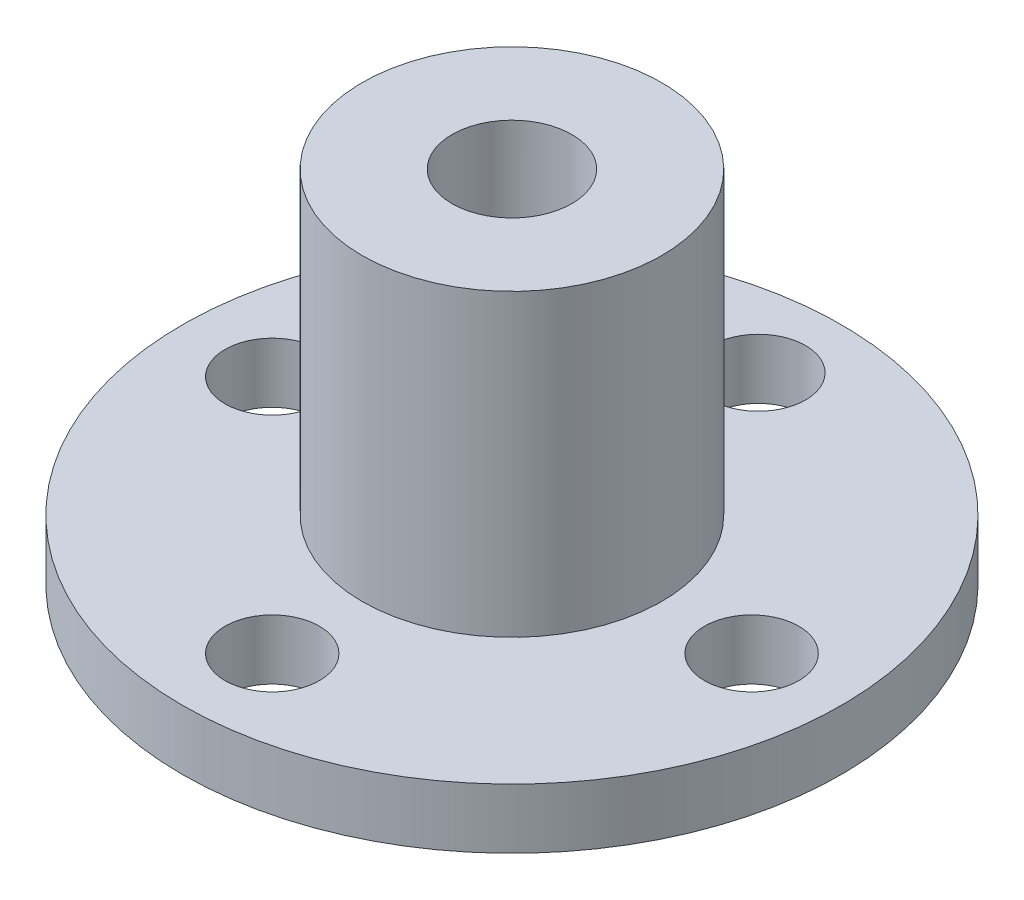
ISO-10303-21;
HEADER;
FILE_DESCRIPTION(('STEP AP214'),'2;1');
FILE_NAME('part.step','',(''),(''),'','','');
FILE_SCHEMA(('AUTOMOTIVE_DESIGN { 1 0 10303 214 1 1 1 1 }'));
ENDSEC;
DATA;
#1=APPLICATION_CONTEXT('core data for automotive mechanical design processes');
#2=APPLICATION_PROTOCOL_DEFINITION('international standard','automotive_design',2000,#1);
#3=PRODUCT_CONTEXT('',#1,'mechanical');
#4=PRODUCT('Part','Part','',(#3));
#5=PRODUCT_RELATED_PRODUCT_CATEGORY('part','',(#4));
#6=PRODUCT_DEFINITION_FORMATION('','',#4);
#7=PRODUCT_DEFINITION_CONTEXT('part definition',#1,'design');
#8=PRODUCT_DEFINITION('design','',#6,#7);
#9=PRODUCT_DEFINITION_SHAPE('','',#8);
#10=(LENGTH_UNIT() NAMED_UNIT(*) SI_UNIT(.MILLI.,.METRE.));
#11=(NAMED_UNIT(*) PLANE_ANGLE_UNIT() SI_UNIT($,.RADIAN.));
#12=(NAMED_UNIT(*) SI_UNIT($,.STERADIAN.) SOLID_ANGLE_UNIT());
#13=UNCERTAINTY_MEASURE_WITH_UNIT(LENGTH_MEASURE(1.E-05),#10,'distance_accuracy_value','');
#14=(GEOMETRIC_REPRESENTATION_CONTEXT(3) GLOBAL_UNCERTAINTY_ASSIGNED_CONTEXT((#13)) GLOBAL_UNIT_ASSIGNED_CONTEXT((#10,
#11,#12)) REPRESENTATION_CONTEXT('',''));
#15=CARTESIAN_POINT('',(0.,0.,0.));
#16=DIRECTION('',(0.,0.,1.));
#17=DIRECTION('',(1.,0.,0.));
#18=AXIS2_PLACEMENT_3D('',#15,#16,#17);
#19=CARTESIAN_POINT('',(0.,2.,0.));
#20=DIRECTION('',(0.,-1.,0.));
#21=DIRECTION('',(0.,0.,-1.));
#22=AXIS2_PLACEMENT_3D('',#19,#20,#21);
#23=CYLINDRICAL_SURFACE('',#22,11.);
#24=CARTESIAN_POINT('',(0.,2.,0.));
#25=DIRECTION('',(0.,1.,0.));
#26=DIRECTION('',(0.,0.,1.));
#27=AXIS2_PLACEMENT_3D('',#24,#25,#26);
#28=CIRCLE('',#27,11.);
#29=CARTESIAN_POINT('',(0.,2.,11.));
#30=VERTEX_POINT('',#29);
#31=EDGE_CURVE('E47',#30,#30,#28,.T.);
#32=ORIENTED_EDGE('',*,*,#31,.F.);
#33=EDGE_LOOP('',(#32));
#34=FACE_BOUND('',#33,.T.);
#35=CARTESIAN_POINT('',(0.,0.,0.));
#36=DIRECTION('',(0.,1.,0.));
#37=DIRECTION('',(0.,0.,1.));
#38=AXIS2_PLACEMENT_3D('',#35,#36,#37);
#39=CIRCLE('',#38,11.);
#40=CARTESIAN_POINT('',(0.,0.,11.));
#41=VERTEX_POINT('',#40);
#42=EDGE_CURVE('E52',#41,#41,#39,.T.);
#43=ORIENTED_EDGE('',*,*,#42,.T.);
#44=EDGE_LOOP('',(#43));
#45=FACE_BOUND('',#44,.T.);
#46=ADVANCED_FACE('F35',(#34,#45),#23,.T.);
#47=CARTESIAN_POINT('',(0.,2.,0.));
#48=DIRECTION('',(0.,1.,0.));
#49=DIRECTION('',(0.,0.,1.));
#50=AXIS2_PLACEMENT_3D('',#47,#48,#49);
#51=PLANE('',#50);
#52=CARTESIAN_POINT('',(-8.,2.,0.));
#53=DIRECTION('',(0.,1.,0.));
#54=DIRECTION('',(0.,0.,1.));
#55=AXIS2_PLACEMENT_3D('',#52,#53,#54);
#56=CIRCLE('',#55,1.57499999999999);
#57=CARTESIAN_POINT('',(-8.,2.,1.57499999999999));
#58=VERTEX_POINT('',#57);
#59=EDGE_CURVE('E118',#58,#58,#56,.T.);
#60=ORIENTED_EDGE('',*,*,#59,.F.);
#61=EDGE_LOOP('',(#60));
#62=FACE_BOUND('',#61,.T.);
#63=CARTESIAN_POINT('',(0.,2.,-8.22505420593829));
#64=DIRECTION('',(0.,1.,0.));
#65=DIRECTION('',(0.,0.,1.));
#66=AXIS2_PLACEMENT_3D('',#63,#64,#65);
#67=CIRCLE('',#66,1.57499999999999);
#68=CARTESIAN_POINT('',(0.,2.,-6.6500542059383));
#69=VERTEX_POINT('',#68);
#70=EDGE_CURVE('E122',#69,#69,#67,.T.);
#71=ORIENTED_EDGE('',*,*,#70,.F.);
#72=EDGE_LOOP('',(#71));
#73=FACE_BOUND('',#72,.T.);
#74=CARTESIAN_POINT('',(8.,2.,0.));
#75=DIRECTION('',(0.,1.,0.));
#76=DIRECTION('',(0.,0.,1.));
#77=AXIS2_PLACEMENT_3D('',#74,#75,#76);
#78=CIRCLE('',#77,1.57499999999999);
#79=CARTESIAN_POINT('',(8.,2.,1.57499999999999));
#80=VERTEX_POINT('',#79);
#81=EDGE_CURVE('E74',#80,#80,#78,.T.);
#82=ORIENTED_EDGE('',*,*,#81,.F.);
#83=EDGE_LOOP('',(#82));
#84=FACE_BOUND('',#83,.T.);
#85=CARTESIAN_POINT('',(0.,2.,8.));
#86=DIRECTION('',(0.,1.,0.));
#87=DIRECTION('',(0.,0.,1.));
#88=AXIS2_PLACEMENT_3D('',#85,#86,#87);
#89=CIRCLE('',#88,1.57499999999999);
#90=CARTESIAN_POINT('',(0.,2.,9.57499999999999));
#91=VERTEX_POINT('',#90);
#92=EDGE_CURVE('E62',#91,#91,#89,.T.);
#93=ORIENTED_EDGE('',*,*,#92,.F.);
#94=EDGE_LOOP('',(#93));
#95=FACE_BOUND('',#94,.T.);
#96=CARTESIAN_POINT('',(0.,2.,0.));
#97=DIRECTION('',(0.,1.,0.));
#98=DIRECTION('',(0.,0.,1.));
#99=AXIS2_PLACEMENT_3D('',#96,#97,#98);
#100=CIRCLE('',#99,5.);
#101=CARTESIAN_POINT('',(0.,2.,5.));
#102=VERTEX_POINT('',#101);
#103=EDGE_CURVE('E10',#102,#102,#100,.T.);
#104=ORIENTED_EDGE('',*,*,#103,.F.);
#105=EDGE_LOOP('',(#104));
#106=FACE_BOUND('',#105,.T.);
#107=ORIENTED_EDGE('',*,*,#31,.T.);
#108=EDGE_LOOP('',(#107));
#109=FACE_BOUND('',#108,.T.);
#110=ADVANCED_FACE('F97',(#62,#73,#84,#95,#106,#109),#51,.T.);
#111=CARTESIAN_POINT('',(0.,0.,0.));
#112=DIRECTION('',(0.,1.,0.));
#113=DIRECTION('',(0.,0.,1.));
#114=AXIS2_PLACEMENT_3D('',#111,#112,#113);
#115=PLANE('',#114);
#116=CARTESIAN_POINT('',(-8.,0.,0.));
#117=DIRECTION('',(0.,1.,0.));
#118=DIRECTION('',(0.,0.,1.));
#119=AXIS2_PLACEMENT_3D('',#116,#117,#118);
#120=CIRCLE('',#119,1.57499999999999);
#121=CARTESIAN_POINT('',(-8.,0.,1.57499999999999));
#122=VERTEX_POINT('',#121);
#123=EDGE_CURVE('E133',#122,#122,#120,.T.);
#124=ORIENTED_EDGE('',*,*,#123,.T.);
#125=EDGE_LOOP('',(#124));
#126=FACE_BOUND('',#125,.T.);
#127=CARTESIAN_POINT('',(0.,0.,-8.22505420593829));
#128=DIRECTION('',(0.,1.,0.));
#129=DIRECTION('',(0.,0.,1.));
#130=AXIS2_PLACEMENT_3D('',#127,#128,#129);
#131=CIRCLE('',#130,1.57499999999999);
#132=CARTESIAN_POINT('',(0.,0.,-6.6500542059383));
#133=VERTEX_POINT('',#132);
#134=EDGE_CURVE('E128',#133,#133,#131,.T.);
#135=ORIENTED_EDGE('',*,*,#134,.T.);
#136=EDGE_LOOP('',(#135));
#137=FACE_BOUND('',#136,.T.);
#138=CARTESIAN_POINT('',(8.,0.,0.));
#139=DIRECTION('',(0.,1.,0.));
#140=DIRECTION('',(0.,0.,1.));
#141=AXIS2_PLACEMENT_3D('',#138,#139,#140);
#142=CIRCLE('',#141,1.57499999999999);
#143=CARTESIAN_POINT('',(8.,0.,1.57499999999999));
#144=VERTEX_POINT('',#143);
#145=EDGE_CURVE('E69',#144,#144,#142,.T.);
#146=ORIENTED_EDGE('',*,*,#145,.T.);
#147=EDGE_LOOP('',(#146));
#148=FACE_BOUND('',#147,.T.);
#149=CARTESIAN_POINT('',(0.,0.,8.));
#150=DIRECTION('',(0.,1.,0.));
#151=DIRECTION('',(0.,0.,1.));
#152=AXIS2_PLACEMENT_3D('',#149,#150,#151);
#153=CIRCLE('',#152,1.57499999999999);
#154=CARTESIAN_POINT('',(0.,0.,9.57499999999999));
#155=VERTEX_POINT('',#154);
#156=EDGE_CURVE('E59',#155,#155,#153,.T.);
#157=ORIENTED_EDGE('',*,*,#156,.T.);
#158=EDGE_LOOP('',(#157));
#159=FACE_BOUND('',#158,.T.);
#160=CARTESIAN_POINT('',(0.,0.,0.));
#161=DIRECTION('',(0.,1.,0.));
#162=DIRECTION('',(0.,0.,1.));
#163=AXIS2_PLACEMENT_3D('',#160,#161,#162);
#164=CIRCLE('',#163,2.);
#165=CARTESIAN_POINT('',(0.,0.,2.));
#166=VERTEX_POINT('',#165);
#167=EDGE_CURVE('E66',#166,#166,#164,.F.);
#168=ORIENTED_EDGE('',*,*,#167,.F.);
#169=EDGE_LOOP('',(#168));
#170=FACE_BOUND('',#169,.T.);
#171=ORIENTED_EDGE('',*,*,#42,.F.);
#172=EDGE_LOOP('',(#171));
#173=FACE_BOUND('',#172,.T.);
#174=ADVANCED_FACE('F87',(#126,#137,#148,#159,#170,#173),#115,.F.);
#175=CARTESIAN_POINT('',(0.,12.,0.));
#176=DIRECTION('',(0.,-1.,0.));
#177=DIRECTION('',(0.,0.,-1.));
#178=AXIS2_PLACEMENT_3D('',#175,#176,#177);
#179=CYLINDRICAL_SURFACE('',#178,5.);
#180=CARTESIAN_POINT('',(0.,8.5,-5.));
#181=CARTESIAN_POINT('',(-0.0822886127532999,8.49999900251511,-4.9999992925055));
#182=CARTESIAN_POINT('',(-0.164587318351529,8.49320613637603,-4.99794915693954));
#183=CARTESIAN_POINT('',(-0.326788125304881,8.4662786457779,-4.98997105593691));
#184=CARTESIAN_POINT('',(-0.40668950441142,8.44614004197666,-4.98404193389692));
#185=CARTESIAN_POINT('',(-0.561732707754527,8.39325398308974,-4.96895552501836));
#186=CARTESIAN_POINT('',(-0.636881364395373,8.36052513038107,-4.95980300250425));
#187=CARTESIAN_POINT('',(-0.780624181053132,8.28346390694417,-4.93922109237645));
#188=CARTESIAN_POINT('',(-0.84921746746967,8.23912999260458,-4.92779140192067));
#189=CARTESIAN_POINT('',(-0.979871797183745,8.13877599252733,-4.90350737192774));
#190=CARTESIAN_POINT('',(-1.04171807124434,8.08248337411409,-4.89062383657036));
#191=CARTESIAN_POINT('',(-1.15524920923324,7.96039077008982,-4.86505834210442));
#192=CARTESIAN_POINT('',(-1.20693236327441,7.89458918787504,-4.85237641724501));
#193=CARTESIAN_POINT('',(-1.29980037723708,7.75352924696239,-4.82834113993772));
#194=CARTESIAN_POINT('',(-1.34072309022213,7.67809153900926,-4.81702406663875));
#195=CARTESIAN_POINT('',(-1.4092139477476,7.52101074576971,-4.79743620394031));
#196=CARTESIAN_POINT('',(-1.43678529919973,7.43936915607202,-4.78916468313311));
#197=CARTESIAN_POINT('',(-1.47701633682652,7.27460973386954,-4.77690870838434));
#198=CARTESIAN_POINT('',(-1.49007196234677,7.19159725613606,-4.77281069324533));
#199=CARTESIAN_POINT('',(-1.50213730614672,7.02446684378323,-4.76902789749767));
#200=CARTESIAN_POINT('',(-1.50115042761078,6.94034918194091,-4.76934204760571));
#201=CARTESIAN_POINT('',(-1.48546977199812,6.77661609139152,-4.77424744067778));
#202=CARTESIAN_POINT('',(-1.47127205262685,6.69694774963776,-4.7786838859914));
#203=CARTESIAN_POINT('',(-1.43037420427056,6.54118021372654,-4.79108356228624));
#204=CARTESIAN_POINT('',(-1.40367284141641,6.46508137262567,-4.79904714132351));
#205=CARTESIAN_POINT('',(-1.33816026653682,6.31739965033926,-4.81772733074973));
#206=CARTESIAN_POINT('',(-1.29918816934642,6.24589291604474,-4.82848016115952));
#207=CARTESIAN_POINT('',(-1.21035222588683,6.11026797798981,-4.85150987000065));
#208=CARTESIAN_POINT('',(-1.16048574002588,6.04615157058622,-4.86378711746991));
#209=CARTESIAN_POINT('',(-1.04881290765546,5.92431380923798,-4.88911011297937));
#210=CARTESIAN_POINT('',(-0.986594907466972,5.86697133597033,-4.90216654310498));
#211=CARTESIAN_POINT('',(-0.853263259313967,5.76344601593575,-4.92712244063259));
#212=CARTESIAN_POINT('',(-0.782149051860888,5.71726387158557,-4.9390218351841));
#213=CARTESIAN_POINT('',(-0.632355038342803,5.63714007753527,-4.9604316006947));
#214=CARTESIAN_POINT('',(-0.55362774974795,5.60328248375014,-4.96992543668314));
#215=CARTESIAN_POINT('',(-0.391245415603519,5.54940040990037,-4.98533521832222));
#216=CARTESIAN_POINT('',(-0.307591751589581,5.52937207146751,-4.99125216186999));
#217=CARTESIAN_POINT('',(-0.140952242668331,5.50434782210061,-4.99868364643538));
#218=CARTESIAN_POINT('',(-0.0580500976011867,5.49883841419839,-5.0003485041779));
#219=CARTESIAN_POINT('',(0.107499605823383,5.50156915571208,-4.9995292324176));
#220=CARTESIAN_POINT('',(0.190147196690781,5.50980746965144,-4.99704565677756));
#221=CARTESIAN_POINT('',(0.350903605309697,5.5393846111115,-4.98830696987163));
#222=CARTESIAN_POINT('',(0.429072772614169,5.56042338758087,-4.98213829799417));
#223=CARTESIAN_POINT('',(0.580754638954522,5.6146432327782,-4.96674347841533));
#224=CARTESIAN_POINT('',(0.654266777025584,5.64782576103786,-4.95751696321085));
#225=CARTESIAN_POINT('',(0.796437189461052,5.72625316548113,-4.93669654351325));
#226=CARTESIAN_POINT('',(0.86494382619967,5.77175934094797,-4.92505280829675));
#227=CARTESIAN_POINT('',(0.993523307980147,5.87322475405281,-4.90073468764318));
#228=CARTESIAN_POINT('',(1.05359403235593,5.92918661188767,-4.8880600443108));
#229=CARTESIAN_POINT('',(1.16585744551027,6.05238730836935,-4.86253171869138));
#230=CARTESIAN_POINT('',(1.21768481231503,6.11996187577174,-4.84968825033268));
#231=CARTESIAN_POINT('',(1.30928995072154,6.26312793901353,-4.82576515238463));
#232=CARTESIAN_POINT('',(1.34906803829472,6.33871922455821,-4.81468547654651));
#233=CARTESIAN_POINT('',(1.41517347127168,6.49553249125469,-4.79567189615055));
#234=CARTESIAN_POINT('',(1.4415634693705,6.57672618653659,-4.78772337843827));
#235=CARTESIAN_POINT('',(1.48021730815114,6.74268796893148,-4.77591594362794));
#236=CARTESIAN_POINT('',(1.49248598978779,6.82745482078767,-4.772055625083));
#237=CARTESIAN_POINT('',(1.50221984485059,6.99436151837623,-4.76899972496087));
#238=CARTESIAN_POINT('',(1.5002805530849,7.07646365101759,-4.76961647442754));
#239=CARTESIAN_POINT('',(1.48307505444813,7.2391141033728,-4.77499401288294));
#240=CARTESIAN_POINT('',(1.46780938124716,7.31966248517635,-4.77975463592551));
#241=CARTESIAN_POINT('',(1.42476888804136,7.47594539914285,-4.79275763670386));
#242=CARTESIAN_POINT('',(1.39715175507068,7.55172728736169,-4.80095604545965));
#243=CARTESIAN_POINT('',(1.33031507121129,7.69764243881772,-4.81990278909136));
#244=CARTESIAN_POINT('',(1.29109329962876,7.76777461764076,-4.83065161194312));
#245=CARTESIAN_POINT('',(1.20048763805072,7.90316311652711,-4.85397676425833));
#246=CARTESIAN_POINT('',(1.14871276092994,7.96814876126041,-4.86660540163798));
#247=CARTESIAN_POINT('',(1.03517434629782,8.08870249830787,-4.89201320450026));
#248=CARTESIAN_POINT('',(0.9734082171345,8.14426813946776,-4.90479240823905));
#249=CARTESIAN_POINT('',(0.839465762183248,8.24602341229503,-4.92950936570649));
#250=CARTESIAN_POINT('',(0.767037885790608,8.29189144685549,-4.94141159765674));
#251=CARTESIAN_POINT('',(0.61514137398353,8.37073516990402,-4.96260680455813));
#252=CARTESIAN_POINT('',(0.535676052998955,8.40371688827451,-4.97190099931067));
#253=CARTESIAN_POINT('',(0.380757712655281,8.45289527565275,-4.98602174969301));
#254=CARTESIAN_POINT('',(0.305786961954234,8.47051167288325,-4.99122027381068));
#255=CARTESIAN_POINT('',(0.15388019523078,8.49406352524158,-4.99820944494492));
#256=CARTESIAN_POINT('',(0.0769445098581397,8.50000093270482,-5.0000006615474));
#257=CARTESIAN_POINT('',(0.,8.5,-5.));
#258=B_SPLINE_CURVE_WITH_KNOTS('',3,(#180,#181,#182,#183,#184,#185,#186,#187,#188,#189,#190,
#191,#192,#193,#194,#195,#196,#197,#198,#199,#200,#201,#202,#203,#204,#205,#206,#207,#208,#209,
#210,#211,#212,#213,#214,#215,#216,#217,#218,#219,#220,#221,#222,#223,#224,#225,#226,#227,#228,
#229,#230,#231,#232,#233,#234,#235,#236,#237,#238,#239,#240,#241,#242,#243,#244,#245,#246,#247,
#248,#249,#250,#251,#252,#253,#254,#255,#256,#257),.UNSPECIFIED.,.T.,.F.,(4,2,2,2,2,2,2,2,2,2,2,
2,2,2,2,2,2,2,2,2,2,2,2,2,2,2,2,2,2,2,2,2,2,2,2,2,2,2,4),(0.,0.24658320361261,0.493239964846,
0.739533676300875,0.985860164412702,1.23855602948191,1.49129437288633,1.74971481004109,
2.00807314543224,2.25919689356599,2.51025978319089,2.75226016697676,2.99428443658001,
3.2396242644712,3.48502360158555,3.74067104048167,3.99633456531072,4.25371046881689,
4.51101453528808,4.75908809438545,5.00712853550327,5.24956746682327,5.49203554593729,
5.74011305702908,5.98825282000191,6.24540400322819,6.50254844252681,6.75847814951252,
7.01432009460283,7.25950155466943,7.504673196616,7.74680040402721,7.98897397553107,
8.23996925679931,8.49102974897502,8.74942996156671,9.00770911595235,9.2383169193046,
9.46888616948875),.UNSPECIFIED.);
#259=CARTESIAN_POINT('',(0.,8.5,-5.));
#260=VERTEX_POINT('',#259);
#261=EDGE_CURVE('E137',#260,#260,#258,.T.);
#262=ORIENTED_EDGE('',*,*,#261,.T.);
#263=EDGE_LOOP('',(#262));
#264=FACE_BOUND('',#263,.T.);
#265=CARTESIAN_POINT('',(0.,12.,0.));
#266=DIRECTION('',(0.,1.,0.));
#267=DIRECTION('',(0.,0.,1.));
#268=AXIS2_PLACEMENT_3D('',#265,#266,#267);
#269=CIRCLE('',#268,5.);
#270=CARTESIAN_POINT('',(0.,12.,5.));
#271=VERTEX_POINT('',#270);
#272=EDGE_CURVE('E55',#271,#271,#269,.T.);
#273=ORIENTED_EDGE('',*,*,#272,.F.);
#274=EDGE_LOOP('',(#273));
#275=FACE_BOUND('',#274,.T.);
#276=ORIENTED_EDGE('',*,*,#103,.T.);
#277=EDGE_LOOP('',(#276));
#278=FACE_BOUND('',#277,.T.);
#279=ADVANCED_FACE('F85',(#264,#275,#278),#179,.T.);
#280=CARTESIAN_POINT('',(0.,12.,0.));
#281=DIRECTION('',(0.,1.,0.));
#282=DIRECTION('',(0.,0.,1.));
#283=AXIS2_PLACEMENT_3D('',#280,#281,#282);
#284=PLANE('',#283);
#285=CARTESIAN_POINT('',(0.,12.,0.));
#286=DIRECTION('',(0.,1.,0.));
#287=DIRECTION('',(0.,0.,1.));
#288=AXIS2_PLACEMENT_3D('',#285,#286,#287);
#289=CIRCLE('',#288,2.);
#290=CARTESIAN_POINT('',(0.,12.,2.));
#291=VERTEX_POINT('',#290);
#292=EDGE_CURVE('E61',#291,#291,#289,.T.);
#293=ORIENTED_EDGE('',*,*,#292,.F.);
#294=EDGE_LOOP('',(#293));
#295=FACE_BOUND('',#294,.T.);
#296=ORIENTED_EDGE('',*,*,#272,.T.);
#297=EDGE_LOOP('',(#296));
#298=FACE_BOUND('',#297,.T.);
#299=ADVANCED_FACE('F83',(#295,#298),#284,.T.);
#300=CARTESIAN_POINT('',(0.,-0.000999999999999265,0.));
#301=DIRECTION('',(0.,1.,0.));
#302=DIRECTION('',(0.,0.,1.));
#303=AXIS2_PLACEMENT_3D('',#300,#301,#302);
#304=CYLINDRICAL_SURFACE('',#303,2.);
#305=CARTESIAN_POINT('',(1.5,7.,-1.32287565553229));
#306=CARTESIAN_POINT('',(1.49999219049447,6.93000257657437,-1.32289190044095));
#307=CARTESIAN_POINT('',(1.4950410907442,6.85995416568808,-1.32856366615417));
#308=CARTESIAN_POINT('',(1.47578333210409,6.72267014379052,-1.34990644032801));
#309=CARTESIAN_POINT('',(1.46144878565587,6.65544355498049,-1.3656072516867));
#310=CARTESIAN_POINT('',(1.42483838991846,6.52642015326162,-1.4037512791687));
#311=CARTESIAN_POINT('',(1.40267483444956,6.46456122323754,-1.42609848244814));
#312=CARTESIAN_POINT('',(1.35130655299363,6.34565454555481,-1.47486455031267));
#313=CARTESIAN_POINT('',(1.3221026780169,6.28860621753078,-1.50128292264932));
#314=CARTESIAN_POINT('',(1.25039909811054,6.16788720368341,-1.56177312961147));
#315=CARTESIAN_POINT('',(1.20639573950363,6.10533206577352,-1.59628904009787));
#316=CARTESIAN_POINT('',(1.10933596759308,5.98747453375773,-1.66521164096378));
#317=CARTESIAN_POINT('',(1.05626622282799,5.93218303517973,-1.69961809339876));
#318=CARTESIAN_POINT('',(0.929610192252514,5.81914126134453,-1.77262582436251));
#319=CARTESIAN_POINT('',(0.854047289142163,5.76319403328014,-1.81064921229759));
#320=CARTESIAN_POINT('',(0.69118971482194,5.66537779171716,-1.87882809751632));
#321=CARTESIAN_POINT('',(0.603923293836167,5.62347570253119,-1.90900204180106));
#322=CARTESIAN_POINT('',(0.447869023983645,5.56679231409706,-1.95034258990248));
#323=CARTESIAN_POINT('',(0.381446049692536,5.54764290402153,-1.96449710921006));
#324=CARTESIAN_POINT('',(0.245552609316542,5.51860988400325,-1.98605635937555));
#325=CARTESIAN_POINT('',(0.176084845995169,5.50871822389326,-1.99346695432364));
#326=CARTESIAN_POINT('',(0.0358650926220275,5.49877826613751,-2.00091375578087));
#327=CARTESIAN_POINT('',(-0.0348897591186392,5.49875554562356,-2.00093080057496));
#328=CARTESIAN_POINT('',(-0.175316156674037,5.50861793678029,-1.99354206503066));
#329=CARTESIAN_POINT('',(-0.244987447822227,5.51850534290814,-1.98613456571337));
#330=CARTESIAN_POINT('',(-0.378889193792652,5.54708105058987,-1.96491377944411));
#331=CARTESIAN_POINT('',(-0.443224268236296,5.56545632638707,-1.9513285776568));
#332=CARTESIAN_POINT('',(-0.567680485046397,5.60999564218224,-1.91882278657017));
#333=CARTESIAN_POINT('',(-0.627800705033636,5.63616138051316,-1.89990103394193));
#334=CARTESIAN_POINT('',(-0.74921692186473,5.69852961514531,-1.85561045984504));
#335=CARTESIAN_POINT('',(-0.809935384713599,5.73551209661876,-1.82976540608097));
#336=CARTESIAN_POINT('',(-0.924567250548284,5.81673370397051,-1.77460702483739));
#337=CARTESIAN_POINT('',(-0.978474784621221,5.8609790136999,-1.74529074780453));
#338=CARTESIAN_POINT('',(-1.08908204283329,5.96522334882094,-1.6789376587236));
#339=CARTESIAN_POINT('',(-1.14424493004784,6.0266092100264,-1.64151655866368));
#340=CARTESIAN_POINT('',(-1.24400875556228,6.15783458362194,-1.56725958283769));
#341=CARTESIAN_POINT('',(-1.28860466211477,6.22767809952506,-1.53042399363524));
#342=CARTESIAN_POINT('',(-1.35873206411601,6.36098187024563,-1.46819425999159));
#343=CARTESIAN_POINT('',(-1.38628866868103,6.42298704530065,-1.44197599789983));
#344=CARTESIAN_POINT('',(-1.43319397108784,6.55206528141938,-1.39536741257394));
#345=CARTESIAN_POINT('',(-1.45256121808259,6.61912647969037,-1.37496395320511));
#346=CARTESIAN_POINT('',(-1.47902385350669,6.74368694399832,-1.34640050620232));
#347=CARTESIAN_POINT('',(-1.48779069496582,6.80044708211686,-1.3366153955687));
#348=CARTESIAN_POINT('',(-1.49871760619789,6.91535546617383,-1.32435588438334));
#349=CARTESIAN_POINT('',(-1.50088612873265,6.97350183990282,-1.32187213058307));
#350=CARTESIAN_POINT('',(-1.49845270115552,7.0894789917334,-1.32462868790497));
#351=CARTESIAN_POINT('',(-1.4938482589949,7.14730964580967,-1.32987184207164));
#352=CARTESIAN_POINT('',(-1.47822527271969,7.26107615244287,-1.34721218775046));
#353=CARTESIAN_POINT('',(-1.46719578056394,7.3170085979481,-1.35932107727345));
#354=CARTESIAN_POINT('',(-1.43413959562387,7.44633804493887,-1.39427758287802));
#355=CARTESIAN_POINT('',(-1.40954189769242,7.51843595391503,-1.41944823697315));
#356=CARTESIAN_POINT('',(-1.35088877838435,7.65630766364012,-1.47537861079976));
#357=CARTESIAN_POINT('',(-1.31681594335477,7.72206951729475,-1.5061485847723));
#358=CARTESIAN_POINT('',(-1.23869774116696,7.84934900804812,-1.5710828237565));
#359=CARTESIAN_POINT('',(-1.19434110060341,7.91063287621826,-1.60532883846046));
#360=CARTESIAN_POINT('',(-1.09682562914592,8.02600209636125,-1.67347506272361));
#361=CARTESIAN_POINT('',(-1.04366252194463,8.08008392798894,-1.70737509574665));
#362=CARTESIAN_POINT('',(-0.916234513829617,8.19127699162937,-1.77960222623533));
#363=CARTESIAN_POINT('',(-0.839896270946853,8.2464752388576,-1.81728174165357));
#364=CARTESIAN_POINT('',(-0.675551612651264,8.34262073345087,-1.88453104769826));
#365=CARTESIAN_POINT('',(-0.587571029974848,8.38359882458129,-1.91411836052283));
#366=CARTESIAN_POINT('',(-0.430755661496907,8.43843799144687,-1.9541940640238));
#367=CARTESIAN_POINT('',(-0.364250057327468,8.45675679327544,-1.9677547802964));
#368=CARTESIAN_POINT('',(-0.228364464964348,8.48412879630752,-1.98810265589123));
#369=CARTESIAN_POINT('',(-0.158987104561939,8.49319028154851,-1.9948958710696));
#370=CARTESIAN_POINT('',(-0.0191476059403949,8.5015163909286,-2.00113566717063));
#371=CARTESIAN_POINT('',(0.0513166925870914,8.50075801734824,-2.00056500218907));
#372=CARTESIAN_POINT('',(0.191009011030084,8.48943900869876,-1.9920880324381));
#373=CARTESIAN_POINT('',(0.260236696591292,8.47887576229252,-1.98417977344351));
#374=CARTESIAN_POINT('',(0.393521935254975,8.44902508383276,-1.96203400925195));
#375=CARTESIAN_POINT('',(0.457671236511444,8.42999981867845,-1.94798690792879));
#376=CARTESIAN_POINT('',(0.581661343097392,8.38421193438106,-1.91462720575136));
#377=CARTESIAN_POINT('',(0.641501223388818,8.35744766016908,-1.89531347862386));
#378=CARTESIAN_POINT('',(0.762547698766815,8.29372206240403,-1.8501764221064));
#379=CARTESIAN_POINT('',(0.823141236713421,8.25594906864041,-1.82386352707581));
#380=CARTESIAN_POINT('',(0.937414811724217,8.17313355944579,-1.76785506075717));
#381=CARTESIAN_POINT('',(0.991088412383376,8.12808436271395,-1.73815638795658));
#382=CARTESIAN_POINT('',(1.10112380660681,8.0219946334392,-1.67106353042106));
#383=CARTESIAN_POINT('',(1.15591691541996,7.95955360056009,-1.63330922504697));
#384=CARTESIAN_POINT('',(1.2547525342935,7.82613192810012,-1.55866082463332));
#385=CARTESIAN_POINT('',(1.29879110556729,7.75514817396343,-1.52176704921892));
#386=CARTESIAN_POINT('',(1.36695971301455,7.62111674940969,-1.46049601449284));
#387=CARTESIAN_POINT('',(1.39333526337998,7.55966501729344,-1.43513625007637));
#388=CARTESIAN_POINT('',(1.43805398028599,7.43191708694411,-1.39032564651232));
#389=CARTESIAN_POINT('',(1.45641847678344,7.36563430840454,-1.37085915899696));
#390=CARTESIAN_POINT('',(1.4799705775638,7.24921178040307,-1.34532423383262));
#391=CARTESIAN_POINT('',(1.48744249026867,7.20003292870953,-1.33700130265679));
#392=CARTESIAN_POINT('',(1.49745839072448,7.10057766696634,-1.32577295392455));
#393=CARTESIAN_POINT('',(1.50000561211714,7.05030199905627,-1.32286398151145));
#394=CARTESIAN_POINT('',(1.5,7.,-1.32287565553229));
#395=B_SPLINE_CURVE_WITH_KNOTS('',3,(#305,#306,#307,#308,#309,#310,#311,#312,#313,#314,#315,
#316,#317,#318,#319,#320,#321,#322,#323,#324,#325,#326,#327,#328,#329,#330,#331,#332,#333,#334,
#335,#336,#337,#338,#339,#340,#341,#342,#343,#344,#345,#346,#347,#348,#349,#350,#351,#352,#353,
#354,#355,#356,#357,#358,#359,#360,#361,#362,#363,#364,#365,#366,#367,#368,#369,#370,#371,#372,
#373,#374,#375,#376,#377,#378,#379,#380,#381,#382,#383,#384,#385,#386,#387,#388,#389,#390,#391,
#392,#393,#394),.UNSPECIFIED.,.T.,.F.,(4,2,2,2,2,2,2,2,2,2,2,2,2,2,2,2,2,2,2,2,2,2,2,2,2,2,2,2,
2,2,2,2,2,2,2,2,2,2,2,2,2,2,2,2,4),(0.,0.209731776684489,0.420089722582994,0.62754538562014,
0.834975984672344,1.08585208691169,1.33710031031849,1.63964848103538,1.94147907444963,
2.15227725277555,2.36289195870711,2.57405250727807,2.78526195641288,2.9892375589505,
3.19325766108669,3.41936844116895,3.64567274887663,3.91649517204702,4.18744629647933,
4.40499409477196,4.62204646613006,4.79608005545901,4.96989060538193,5.14376512326213,
5.31793678696019,5.55730028202397,5.79710662639151,6.0454320909006,6.29387849446618,
6.59652499511463,6.89851088586565,7.10852896194427,7.31835893539181,7.52868041101044,
7.73905791773945,7.94332812691912,8.14764205379333,8.3751005248961,8.60276905744645,
8.87547580578155,9.14828228208531,9.36218279640835,9.57551025772699,9.72632812073766,
9.87704692032409),.UNSPECIFIED.);
#396=CARTESIAN_POINT('',(1.5,7.,-1.32287565553229));
#397=VERTEX_POINT('',#396);
#398=EDGE_CURVE('E38',#397,#397,#395,.T.);
#399=ORIENTED_EDGE('',*,*,#398,.T.);
#400=EDGE_LOOP('',(#399));
#401=FACE_BOUND('',#400,.T.);
#402=ORIENTED_EDGE('',*,*,#292,.T.);
#403=EDGE_LOOP('',(#402));
#404=FACE_BOUND('',#403,.T.);
#405=ORIENTED_EDGE('',*,*,#167,.T.);
#406=EDGE_LOOP('',(#405));
#407=FACE_BOUND('',#406,.T.);
#408=ADVANCED_FACE('F94',(#401,#404,#407),#304,.F.);
#409=CARTESIAN_POINT('',(0.,2.,8.));
#410=DIRECTION('',(0.,1.,0.));
#411=DIRECTION('',(0.,0.,1.));
#412=AXIS2_PLACEMENT_3D('',#409,#410,#411);
#413=CYLINDRICAL_SURFACE('',#412,1.57499999999999);
#414=ORIENTED_EDGE('',*,*,#92,.T.);
#415=EDGE_LOOP('',(#414));
#416=FACE_BOUND('',#415,.T.);
#417=ORIENTED_EDGE('',*,*,#156,.F.);
#418=EDGE_LOOP('',(#417));
#419=FACE_BOUND('',#418,.T.);
#420=ADVANCED_FACE('F158',(#416,#419),#413,.F.);
#421=CARTESIAN_POINT('',(8.,2.,0.));
#422=DIRECTION('',(0.,1.,0.));
#423=DIRECTION('',(0.,0.,1.));
#424=AXIS2_PLACEMENT_3D('',#421,#422,#423);
#425=CYLINDRICAL_SURFACE('',#424,1.57499999999999);
#426=ORIENTED_EDGE('',*,*,#81,.T.);
#427=EDGE_LOOP('',(#426));
#428=FACE_BOUND('',#427,.T.);
#429=ORIENTED_EDGE('',*,*,#145,.F.);
#430=EDGE_LOOP('',(#429));
#431=FACE_BOUND('',#430,.T.);
#432=ADVANCED_FACE('F154',(#428,#431),#425,.F.);
#433=CARTESIAN_POINT('',(0.,2.,-8.22505420593829));
#434=DIRECTION('',(0.,1.,0.));
#435=DIRECTION('',(0.,0.,1.));
#436=AXIS2_PLACEMENT_3D('',#433,#434,#435);
#437=CYLINDRICAL_SURFACE('',#436,1.57499999999999);
#438=ORIENTED_EDGE('',*,*,#70,.T.);
#439=EDGE_LOOP('',(#438));
#440=FACE_BOUND('',#439,.T.);
#441=ORIENTED_EDGE('',*,*,#134,.F.);
#442=EDGE_LOOP('',(#441));
#443=FACE_BOUND('',#442,.T.);
#444=ADVANCED_FACE('F150',(#440,#443),#437,.F.);
#445=CARTESIAN_POINT('',(-8.,2.,0.));
#446=DIRECTION('',(0.,1.,0.));
#447=DIRECTION('',(0.,0.,1.));
#448=AXIS2_PLACEMENT_3D('',#445,#446,#447);
#449=CYLINDRICAL_SURFACE('',#448,1.57499999999999);
#450=ORIENTED_EDGE('',*,*,#59,.T.);
#451=EDGE_LOOP('',(#450));
#452=FACE_BOUND('',#451,.T.);
#453=ORIENTED_EDGE('',*,*,#123,.F.);
#454=EDGE_LOOP('',(#453));
#455=FACE_BOUND('',#454,.T.);
#456=ADVANCED_FACE('F145',(#452,#455),#449,.F.);
#457=CARTESIAN_POINT('',(0.,7.,-10.));
#458=DIRECTION('',(0.,0.,1.));
#459=DIRECTION('',(1.,0.,0.));
#460=AXIS2_PLACEMENT_3D('',#457,#458,#459);
#461=CYLINDRICAL_SURFACE('',#460,1.5);
#462=ORIENTED_EDGE('',*,*,#398,.F.);
#463=EDGE_LOOP('',(#462));
#464=FACE_BOUND('',#463,.T.);
#465=ORIENTED_EDGE('',*,*,#261,.F.);
#466=EDGE_LOOP('',(#465));
#467=FACE_BOUND('',#466,.T.);
#468=ADVANCED_FACE('F141',(#464,#467),#461,.F.);
#469=CLOSED_SHELL('',(#46,#110,#174,#279,#299,#408,#420,#432,#444,#456,#468));
#470=MANIFOLD_SOLID_BREP('B2',#469);
#471=ADVANCED_BREP_SHAPE_REPRESENTATION('',(#18,#470),#14);
#472=SHAPE_DEFINITION_REPRESENTATION(#9,#471);
ENDSEC;
END-ISO-10303-21;
